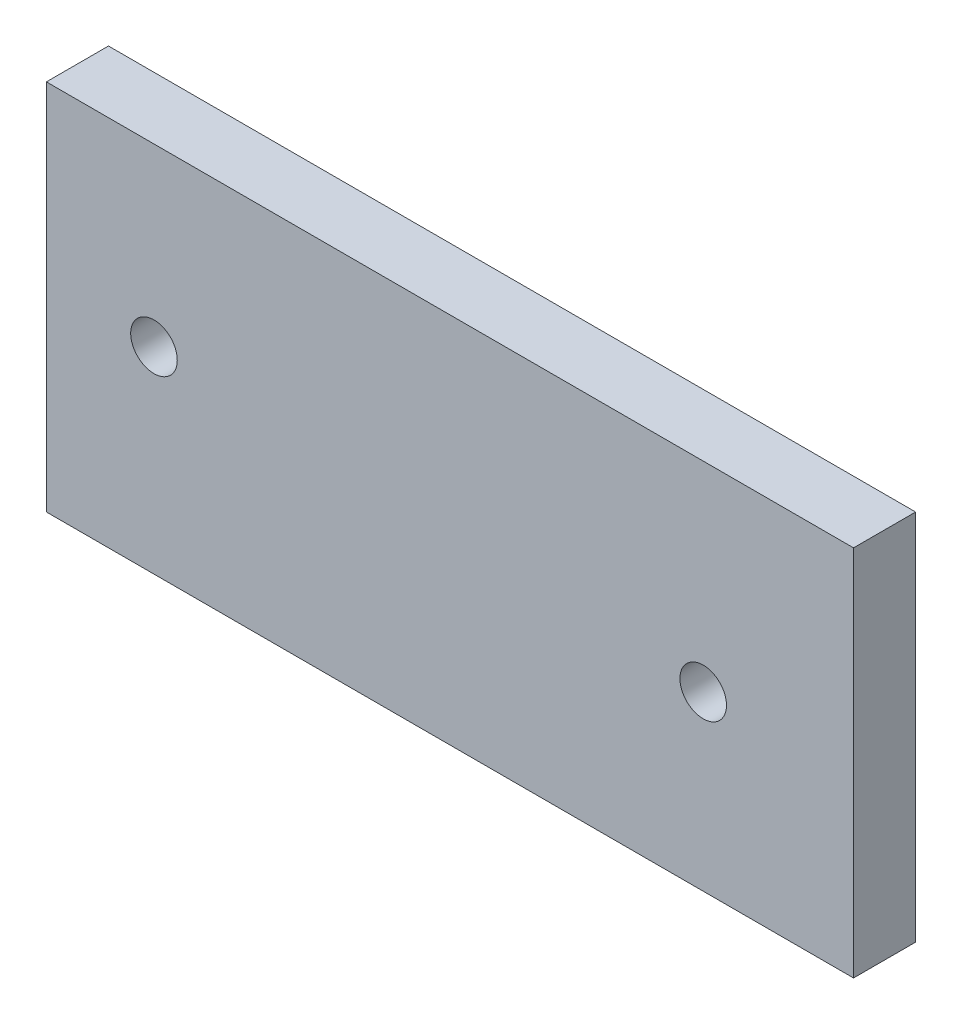
ISO-10303-21;
HEADER;
FILE_DESCRIPTION(('STEP AP214'),'2;1');
FILE_NAME('part.step','',(''),(''),'','','');
FILE_SCHEMA(('AUTOMOTIVE_DESIGN { 1 0 10303 214 1 1 1 1 }'));
ENDSEC;
DATA;
#1=APPLICATION_CONTEXT('core data for automotive mechanical design processes');
#2=APPLICATION_PROTOCOL_DEFINITION('international standard','automotive_design',2000,#1);
#3=PRODUCT_CONTEXT('',#1,'mechanical');
#4=PRODUCT('Part','Part','',(#3));
#5=PRODUCT_RELATED_PRODUCT_CATEGORY('part','',(#4));
#6=PRODUCT_DEFINITION_FORMATION('','',#4);
#7=PRODUCT_DEFINITION_CONTEXT('part definition',#1,'design');
#8=PRODUCT_DEFINITION('design','',#6,#7);
#9=PRODUCT_DEFINITION_SHAPE('','',#8);
#10=(LENGTH_UNIT() NAMED_UNIT(*) SI_UNIT(.MILLI.,.METRE.));
#11=(NAMED_UNIT(*) PLANE_ANGLE_UNIT() SI_UNIT($,.RADIAN.));
#12=(NAMED_UNIT(*) SI_UNIT($,.STERADIAN.) SOLID_ANGLE_UNIT());
#13=UNCERTAINTY_MEASURE_WITH_UNIT(LENGTH_MEASURE(1.E-05),#10,'distance_accuracy_value','');
#14=(GEOMETRIC_REPRESENTATION_CONTEXT(3) GLOBAL_UNCERTAINTY_ASSIGNED_CONTEXT((#13)) GLOBAL_UNIT_ASSIGNED_CONTEXT((#10,
#11,#12)) REPRESENTATION_CONTEXT('',''));
#15=CARTESIAN_POINT('',(0.,0.,0.));
#16=DIRECTION('',(0.,0.,1.));
#17=DIRECTION('',(1.,0.,0.));
#18=AXIS2_PLACEMENT_3D('',#15,#16,#17);
#19=CARTESIAN_POINT('',(0.,0.,20.));
#20=DIRECTION('',(1.,0.,0.));
#21=DIRECTION('',(0.,0.,-1.));
#22=AXIS2_PLACEMENT_3D('',#19,#20,#21);
#23=PLANE('',#22);
#24=DIRECTION('',(0.,-1.,0.));
#25=VECTOR('',#24,1.);
#26=CARTESIAN_POINT('',(0.,0.,0.));
#27=LINE('',#26,#25);
#28=CARTESIAN_POINT('',(0.,120.,0.));
#29=VERTEX_POINT('',#28);
#30=CARTESIAN_POINT('',(0.,0.,0.));
#31=VERTEX_POINT('',#30);
#32=EDGE_CURVE('E105',#29,#31,#27,.T.);
#33=ORIENTED_EDGE('',*,*,#32,.T.);
#34=DIRECTION('',(0.,0.,-1.));
#35=VECTOR('',#34,1.);
#36=CARTESIAN_POINT('',(0.,0.,20.));
#37=LINE('',#36,#35);
#38=CARTESIAN_POINT('',(0.,0.,20.));
#39=VERTEX_POINT('',#38);
#40=EDGE_CURVE('E11',#39,#31,#37,.T.);
#41=ORIENTED_EDGE('',*,*,#40,.F.);
#42=DIRECTION('',(0.,-1.,0.));
#43=VECTOR('',#42,1.);
#44=CARTESIAN_POINT('',(0.,0.,20.));
#45=LINE('',#44,#43);
#46=CARTESIAN_POINT('',(0.,120.,20.));
#47=VERTEX_POINT('',#46);
#48=EDGE_CURVE('E92',#47,#39,#45,.T.);
#49=ORIENTED_EDGE('',*,*,#48,.F.);
#50=DIRECTION('',(0.,0.,-1.));
#51=VECTOR('',#50,1.);
#52=CARTESIAN_POINT('',(0.,120.,20.));
#53=LINE('',#52,#51);
#54=EDGE_CURVE('E101',#47,#29,#53,.T.);
#55=ORIENTED_EDGE('',*,*,#54,.T.);
#56=EDGE_LOOP('',(#33,#41,#49,#55));
#57=FACE_BOUND('',#56,.T.);
#58=ADVANCED_FACE('F39',(#57),#23,.F.);
#59=CARTESIAN_POINT('',(0.,0.,20.));
#60=DIRECTION('',(0.,1.,0.));
#61=DIRECTION('',(0.,0.,1.));
#62=AXIS2_PLACEMENT_3D('',#59,#60,#61);
#63=PLANE('',#62);
#64=DIRECTION('',(1.,0.,0.));
#65=VECTOR('',#64,1.);
#66=CARTESIAN_POINT('',(0.,0.,0.));
#67=LINE('',#66,#65);
#68=CARTESIAN_POINT('',(260.,0.,0.));
#69=VERTEX_POINT('',#68);
#70=EDGE_CURVE('E96',#31,#69,#67,.T.);
#71=ORIENTED_EDGE('',*,*,#70,.T.);
#72=DIRECTION('',(0.,0.,-1.));
#73=VECTOR('',#72,1.);
#74=CARTESIAN_POINT('',(260.,0.,20.));
#75=LINE('',#74,#73);
#76=CARTESIAN_POINT('',(260.,0.,20.));
#77=VERTEX_POINT('',#76);
#78=EDGE_CURVE('E48',#77,#69,#75,.T.);
#79=ORIENTED_EDGE('',*,*,#78,.F.);
#80=DIRECTION('',(1.,0.,0.));
#81=VECTOR('',#80,1.);
#82=CARTESIAN_POINT('',(0.,0.,20.));
#83=LINE('',#82,#81);
#84=EDGE_CURVE('E87',#39,#77,#83,.T.);
#85=ORIENTED_EDGE('',*,*,#84,.F.);
#86=ORIENTED_EDGE('',*,*,#40,.T.);
#87=EDGE_LOOP('',(#71,#79,#85,#86));
#88=FACE_BOUND('',#87,.T.);
#89=ADVANCED_FACE('F95',(#88),#63,.F.);
#90=CARTESIAN_POINT('',(260.,0.,20.));
#91=DIRECTION('',(-1.,0.,0.));
#92=DIRECTION('',(0.,0.,1.));
#93=AXIS2_PLACEMENT_3D('',#90,#91,#92);
#94=PLANE('',#93);
#95=DIRECTION('',(0.,1.,0.));
#96=VECTOR('',#95,1.);
#97=CARTESIAN_POINT('',(260.,0.,0.));
#98=LINE('',#97,#96);
#99=CARTESIAN_POINT('',(260.,120.,0.));
#100=VERTEX_POINT('',#99);
#101=EDGE_CURVE('E74',#69,#100,#98,.T.);
#102=ORIENTED_EDGE('',*,*,#101,.T.);
#103=DIRECTION('',(0.,0.,-1.));
#104=VECTOR('',#103,1.);
#105=CARTESIAN_POINT('',(260.,120.,20.));
#106=LINE('',#105,#104);
#107=CARTESIAN_POINT('',(260.,120.,20.));
#108=VERTEX_POINT('',#107);
#109=EDGE_CURVE('E97',#108,#100,#106,.T.);
#110=ORIENTED_EDGE('',*,*,#109,.F.);
#111=DIRECTION('',(0.,1.,0.));
#112=VECTOR('',#111,1.);
#113=CARTESIAN_POINT('',(260.,0.,20.));
#114=LINE('',#113,#112);
#115=EDGE_CURVE('E90',#77,#108,#114,.T.);
#116=ORIENTED_EDGE('',*,*,#115,.F.);
#117=ORIENTED_EDGE('',*,*,#78,.T.);
#118=EDGE_LOOP('',(#102,#110,#116,#117));
#119=FACE_BOUND('',#118,.T.);
#120=ADVANCED_FACE('F99',(#119),#94,.F.);
#121=CARTESIAN_POINT('',(0.,120.,20.));
#122=DIRECTION('',(0.,-1.,0.));
#123=DIRECTION('',(0.,0.,-1.));
#124=AXIS2_PLACEMENT_3D('',#121,#122,#123);
#125=PLANE('',#124);
#126=DIRECTION('',(-1.,0.,0.));
#127=VECTOR('',#126,1.);
#128=CARTESIAN_POINT('',(0.,120.,0.));
#129=LINE('',#128,#127);
#130=EDGE_CURVE('E80',#100,#29,#129,.T.);
#131=ORIENTED_EDGE('',*,*,#130,.T.);
#132=ORIENTED_EDGE('',*,*,#54,.F.);
#133=DIRECTION('',(-1.,0.,0.));
#134=VECTOR('',#133,1.);
#135=CARTESIAN_POINT('',(0.,120.,20.));
#136=LINE('',#135,#134);
#137=EDGE_CURVE('E57',#108,#47,#136,.T.);
#138=ORIENTED_EDGE('',*,*,#137,.F.);
#139=ORIENTED_EDGE('',*,*,#109,.T.);
#140=EDGE_LOOP('',(#131,#132,#138,#139));
#141=FACE_BOUND('',#140,.T.);
#142=ADVANCED_FACE('F131',(#141),#125,.F.);
#143=CARTESIAN_POINT('',(0.,0.,20.));
#144=DIRECTION('',(0.,0.,-1.));
#145=DIRECTION('',(-1.,0.,0.));
#146=AXIS2_PLACEMENT_3D('',#143,#144,#145);
#147=PLANE('',#146);
#148=CARTESIAN_POINT('',(34.659012511935,63.4233332779039,20.));
#149=DIRECTION('',(0.,0.,1.));
#150=DIRECTION('',(1.,0.,0.));
#151=AXIS2_PLACEMENT_3D('',#148,#149,#150);
#152=CIRCLE('',#151,7.5);
#153=CARTESIAN_POINT('',(42.159012511935,63.4233332779039,20.));
#154=VERTEX_POINT('',#153);
#155=EDGE_CURVE('E114',#154,#154,#152,.T.);
#156=ORIENTED_EDGE('',*,*,#155,.F.);
#157=EDGE_LOOP('',(#156));
#158=FACE_BOUND('',#157,.T.);
#159=CARTESIAN_POINT('',(211.577834087185,55.5935397874577,20.));
#160=DIRECTION('',(0.,0.,1.));
#161=DIRECTION('',(1.,0.,0.));
#162=AXIS2_PLACEMENT_3D('',#159,#160,#161);
#163=CIRCLE('',#162,7.50000000000001);
#164=CARTESIAN_POINT('',(219.077834087185,55.5935397874577,20.));
#165=VERTEX_POINT('',#164);
#166=EDGE_CURVE('E119',#165,#165,#163,.T.);
#167=ORIENTED_EDGE('',*,*,#166,.F.);
#168=EDGE_LOOP('',(#167));
#169=FACE_BOUND('',#168,.T.);
#170=ORIENTED_EDGE('',*,*,#48,.T.);
#171=ORIENTED_EDGE('',*,*,#84,.T.);
#172=ORIENTED_EDGE('',*,*,#115,.T.);
#173=ORIENTED_EDGE('',*,*,#137,.T.);
#174=EDGE_LOOP('',(#170,#171,#172,#173));
#175=FACE_BOUND('',#174,.T.);
#176=ADVANCED_FACE('F88',(#158,#169,#175),#147,.F.);
#177=CARTESIAN_POINT('',(0.,0.,0.));
#178=DIRECTION('',(0.,0.,-1.));
#179=DIRECTION('',(-1.,0.,0.));
#180=AXIS2_PLACEMENT_3D('',#177,#178,#179);
#181=PLANE('',#180);
#182=CARTESIAN_POINT('',(34.659012511935,63.4233332779039,0.));
#183=DIRECTION('',(0.,0.,-1.));
#184=DIRECTION('',(-1.,0.,0.));
#185=AXIS2_PLACEMENT_3D('',#182,#183,#184);
#186=CIRCLE('',#185,7.5);
#187=CARTESIAN_POINT('',(27.159012511935,63.4233332779039,0.));
#188=VERTEX_POINT('',#187);
#189=EDGE_CURVE('E42',#188,#188,#186,.T.);
#190=ORIENTED_EDGE('',*,*,#189,.F.);
#191=EDGE_LOOP('',(#190));
#192=FACE_BOUND('',#191,.T.);
#193=CARTESIAN_POINT('',(211.577834087185,55.5935397874577,0.));
#194=DIRECTION('',(0.,0.,-1.));
#195=DIRECTION('',(-1.,0.,0.));
#196=AXIS2_PLACEMENT_3D('',#193,#194,#195);
#197=CIRCLE('',#196,7.50000000000001);
#198=CARTESIAN_POINT('',(204.077834087185,55.5935397874577,0.));
#199=VERTEX_POINT('',#198);
#200=EDGE_CURVE('E112',#199,#199,#197,.T.);
#201=ORIENTED_EDGE('',*,*,#200,.F.);
#202=EDGE_LOOP('',(#201));
#203=FACE_BOUND('',#202,.T.);
#204=ORIENTED_EDGE('',*,*,#32,.F.);
#205=ORIENTED_EDGE('',*,*,#130,.F.);
#206=ORIENTED_EDGE('',*,*,#101,.F.);
#207=ORIENTED_EDGE('',*,*,#70,.F.);
#208=EDGE_LOOP('',(#204,#205,#206,#207));
#209=FACE_BOUND('',#208,.T.);
#210=ADVANCED_FACE('F130',(#192,#203,#209),#181,.T.);
#211=CARTESIAN_POINT('',(211.577834087185,55.5935397874577,-10.));
#212=DIRECTION('',(0.,0.,1.));
#213=DIRECTION('',(1.,0.,0.));
#214=AXIS2_PLACEMENT_3D('',#211,#212,#213);
#215=CYLINDRICAL_SURFACE('',#214,7.50000000000001);
#216=ORIENTED_EDGE('',*,*,#200,.T.);
#217=EDGE_LOOP('',(#216));
#218=FACE_BOUND('',#217,.T.);
#219=ORIENTED_EDGE('',*,*,#166,.T.);
#220=EDGE_LOOP('',(#219));
#221=FACE_BOUND('',#220,.T.);
#222=ADVANCED_FACE('F127',(#218,#221),#215,.F.);
#223=CARTESIAN_POINT('',(34.659012511935,63.4233332779039,-10.));
#224=DIRECTION('',(0.,0.,1.));
#225=DIRECTION('',(1.,0.,0.));
#226=AXIS2_PLACEMENT_3D('',#223,#224,#225);
#227=CYLINDRICAL_SURFACE('',#226,7.5);
#228=ORIENTED_EDGE('',*,*,#189,.T.);
#229=EDGE_LOOP('',(#228));
#230=FACE_BOUND('',#229,.T.);
#231=ORIENTED_EDGE('',*,*,#155,.T.);
#232=EDGE_LOOP('',(#231));
#233=FACE_BOUND('',#232,.T.);
#234=ADVANCED_FACE('F181',(#230,#233),#227,.F.);
#235=CLOSED_SHELL('',(#58,#89,#120,#142,#176,#210,#222,#234));
#236=MANIFOLD_SOLID_BREP('B2',#235);
#237=ADVANCED_BREP_SHAPE_REPRESENTATION('',(#18,#236),#14);
#238=SHAPE_DEFINITION_REPRESENTATION(#9,#237);
ENDSEC;
END-ISO-10303-21;
